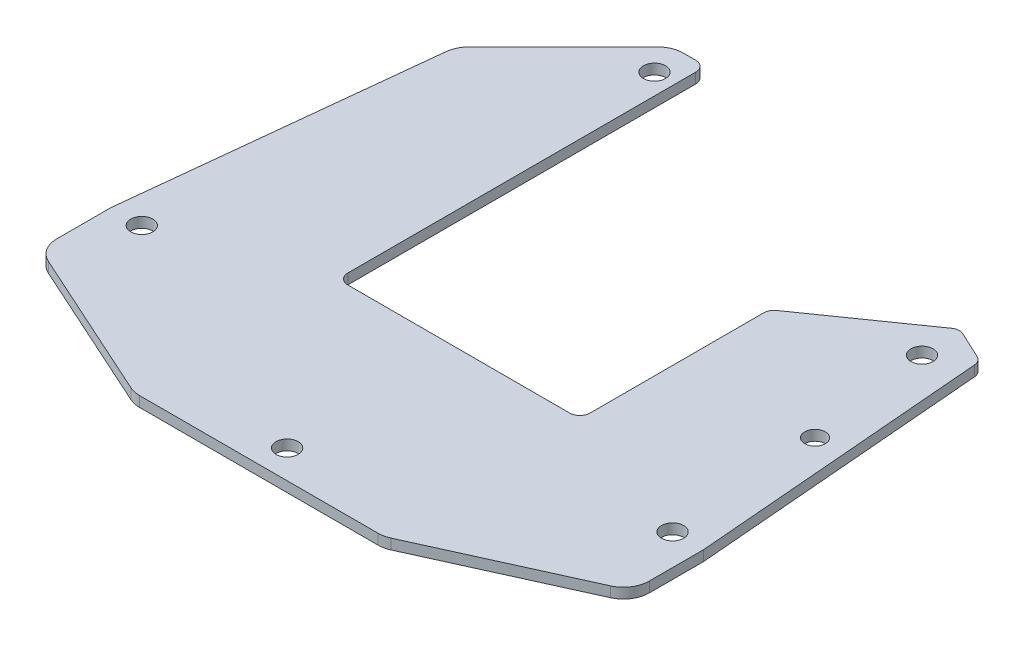
ISO-10303-21;
HEADER;
FILE_DESCRIPTION(('STEP AP214'),'2;1');
FILE_NAME('part.step','',(''),(''),'','','');
FILE_SCHEMA(('AUTOMOTIVE_DESIGN { 1 0 10303 214 1 1 1 1 }'));
ENDSEC;
DATA;
#1=APPLICATION_CONTEXT('core data for automotive mechanical design processes');
#2=APPLICATION_PROTOCOL_DEFINITION('international standard','automotive_design',2000,#1);
#3=PRODUCT_CONTEXT('',#1,'mechanical');
#4=PRODUCT('Part','Part','',(#3));
#5=PRODUCT_RELATED_PRODUCT_CATEGORY('part','',(#4));
#6=PRODUCT_DEFINITION_FORMATION('','',#4);
#7=PRODUCT_DEFINITION_CONTEXT('part definition',#1,'design');
#8=PRODUCT_DEFINITION('design','',#6,#7);
#9=PRODUCT_DEFINITION_SHAPE('','',#8);
#10=(LENGTH_UNIT() NAMED_UNIT(*) SI_UNIT(.MILLI.,.METRE.));
#11=(NAMED_UNIT(*) PLANE_ANGLE_UNIT() SI_UNIT($,.RADIAN.));
#12=(NAMED_UNIT(*) SI_UNIT($,.STERADIAN.) SOLID_ANGLE_UNIT());
#13=UNCERTAINTY_MEASURE_WITH_UNIT(LENGTH_MEASURE(1.E-05),#10,'distance_accuracy_value','');
#14=(GEOMETRIC_REPRESENTATION_CONTEXT(3) GLOBAL_UNCERTAINTY_ASSIGNED_CONTEXT((#13)) GLOBAL_UNIT_ASSIGNED_CONTEXT((#10,
#11,#12)) REPRESENTATION_CONTEXT('',''));
#15=CARTESIAN_POINT('',(0.,0.,0.));
#16=DIRECTION('',(0.,0.,1.));
#17=DIRECTION('',(1.,0.,0.));
#18=AXIS2_PLACEMENT_3D('',#15,#16,#17);
#19=CARTESIAN_POINT('',(-23.525,42.5,0.));
#20=DIRECTION('',(-1.,0.,0.));
#21=DIRECTION('',(0.,0.,1.));
#22=AXIS2_PLACEMENT_3D('',#19,#20,#21);
#23=PLANE('',#22);
#24=DIRECTION('',(0.,0.,-1.));
#25=VECTOR('',#24,1.);
#26=CARTESIAN_POINT('',(-23.525,40.5,0.));
#27=LINE('',#26,#25);
#28=CARTESIAN_POINT('',(-23.525,40.5,74.028736037846));
#29=VERTEX_POINT('',#28);
#30=CARTESIAN_POINT('',(-23.525,40.5,6.50000000000001));
#31=VERTEX_POINT('',#30);
#32=EDGE_CURVE('E265',#29,#31,#27,.T.);
#33=ORIENTED_EDGE('',*,*,#32,.T.);
#34=DIRECTION('',(0.,-1.,0.));
#35=VECTOR('',#34,1.);
#36=CARTESIAN_POINT('',(-23.525,42.5,6.50000000000001));
#37=LINE('',#36,#35);
#38=CARTESIAN_POINT('',(-23.525,42.5,6.50000000000001));
#39=VERTEX_POINT('',#38);
#40=EDGE_CURVE('E11',#39,#31,#37,.T.);
#41=ORIENTED_EDGE('',*,*,#40,.F.);
#42=DIRECTION('',(0.,0.,-1.));
#43=VECTOR('',#42,1.);
#44=CARTESIAN_POINT('',(-23.525,42.5,0.));
#45=LINE('',#44,#43);
#46=CARTESIAN_POINT('',(-23.525,42.5,74.028736037846));
#47=VERTEX_POINT('',#46);
#48=EDGE_CURVE('E855',#47,#39,#45,.T.);
#49=ORIENTED_EDGE('',*,*,#48,.F.);
#50=DIRECTION('',(0.,-1.,0.));
#51=VECTOR('',#50,1.);
#52=CARTESIAN_POINT('',(-23.525,42.5,74.028736037846));
#53=LINE('',#52,#51);
#54=EDGE_CURVE('E58',#47,#29,#53,.T.);
#55=ORIENTED_EDGE('',*,*,#54,.T.);
#56=EDGE_LOOP('',(#33,#41,#49,#55));
#57=FACE_BOUND('',#56,.T.);
#58=ADVANCED_FACE('F41',(#57),#23,.F.);
#59=CARTESIAN_POINT('',(-25.525,42.5,6.5));
#60=DIRECTION('',(0.,-1.,0.));
#61=DIRECTION('',(0.,0.,-1.));
#62=AXIS2_PLACEMENT_3D('',#59,#60,#61);
#63=CYLINDRICAL_SURFACE('',#62,2.);
#64=CARTESIAN_POINT('',(-25.525,40.5,6.5));
#65=DIRECTION('',(0.,1.,0.));
#66=DIRECTION('',(0.,0.,1.));
#67=AXIS2_PLACEMENT_3D('',#64,#65,#66);
#68=CIRCLE('',#67,2.);
#69=CARTESIAN_POINT('',(-25.525,40.5,4.5));
#70=VERTEX_POINT('',#69);
#71=EDGE_CURVE('E267',#31,#70,#68,.T.);
#72=ORIENTED_EDGE('',*,*,#71,.T.);
#73=DIRECTION('',(0.,-1.,0.));
#74=VECTOR('',#73,1.);
#75=CARTESIAN_POINT('',(-25.525,42.5,4.5));
#76=LINE('',#75,#74);
#77=CARTESIAN_POINT('',(-25.525,42.5,4.5));
#78=VERTEX_POINT('',#77);
#79=EDGE_CURVE('E50',#78,#70,#76,.T.);
#80=ORIENTED_EDGE('',*,*,#79,.F.);
#81=CARTESIAN_POINT('',(-25.525,42.5,6.5));
#82=DIRECTION('',(0.,1.,0.));
#83=DIRECTION('',(0.,0.,1.));
#84=AXIS2_PLACEMENT_3D('',#81,#82,#83);
#85=CIRCLE('',#84,2.);
#86=EDGE_CURVE('E150',#39,#78,#85,.T.);
#87=ORIENTED_EDGE('',*,*,#86,.F.);
#88=ORIENTED_EDGE('',*,*,#40,.T.);
#89=EDGE_LOOP('',(#72,#80,#87,#88));
#90=FACE_BOUND('',#89,.T.);
#91=ADVANCED_FACE('F468',(#90),#63,.T.);
#92=CARTESIAN_POINT('',(0.,42.5,4.5));
#93=DIRECTION('',(0.,0.,1.));
#94=DIRECTION('',(1.,0.,0.));
#95=AXIS2_PLACEMENT_3D('',#92,#93,#94);
#96=PLANE('',#95);
#97=DIRECTION('',(-1.,0.,0.));
#98=VECTOR('',#97,1.);
#99=CARTESIAN_POINT('',(0.,40.5,4.5));
#100=LINE('',#99,#98);
#101=CARTESIAN_POINT('',(-27.9392135623731,40.5,4.5));
#102=VERTEX_POINT('',#101);
#103=EDGE_CURVE('E269',#70,#102,#100,.T.);
#104=ORIENTED_EDGE('',*,*,#103,.T.);
#105=DIRECTION('',(0.,-1.,0.));
#106=VECTOR('',#105,1.);
#107=CARTESIAN_POINT('',(-27.9392135623731,42.5,4.5));
#108=LINE('',#107,#106);
#109=CARTESIAN_POINT('',(-27.9392135623731,42.5,4.5));
#110=VERTEX_POINT('',#109);
#111=EDGE_CURVE('E379',#110,#102,#108,.T.);
#112=ORIENTED_EDGE('',*,*,#111,.F.);
#113=DIRECTION('',(-1.,0.,0.));
#114=VECTOR('',#113,1.);
#115=CARTESIAN_POINT('',(0.,42.5,4.5));
#116=LINE('',#115,#114);
#117=EDGE_CURVE('E386',#78,#110,#116,.T.);
#118=ORIENTED_EDGE('',*,*,#117,.F.);
#119=ORIENTED_EDGE('',*,*,#79,.T.);
#120=EDGE_LOOP('',(#104,#112,#118,#119));
#121=FACE_BOUND('',#120,.T.);
#122=ADVANCED_FACE('F384',(#121),#96,.F.);
#123=CARTESIAN_POINT('',(-27.9392135623731,42.5,9.50000000000001));
#124=DIRECTION('',(0.,-1.,0.));
#125=DIRECTION('',(0.,0.,-1.));
#126=AXIS2_PLACEMENT_3D('',#123,#124,#125);
#127=CYLINDRICAL_SURFACE('',#126,5.);
#128=CARTESIAN_POINT('',(-27.9392135623731,40.5,9.50000000000001));
#129=DIRECTION('',(0.,1.,0.));
#130=DIRECTION('',(0.,0.,1.));
#131=AXIS2_PLACEMENT_3D('',#128,#129,#130);
#132=CIRCLE('',#131,5.);
#133=CARTESIAN_POINT('',(-31.4747474683059,40.5,5.96446609406728));
#134=VERTEX_POINT('',#133);
#135=EDGE_CURVE('E272',#134,#102,#132,.F.);
#136=ORIENTED_EDGE('',*,*,#135,.F.);
#137=DIRECTION('',(0.,-1.,0.));
#138=VECTOR('',#137,1.);
#139=CARTESIAN_POINT('',(-31.4747474683059,42.5,5.96446609406728));
#140=LINE('',#139,#138);
#141=CARTESIAN_POINT('',(-31.4747474683059,42.5,5.96446609406728));
#142=VERTEX_POINT('',#141);
#143=EDGE_CURVE('E377',#142,#134,#140,.T.);
#144=ORIENTED_EDGE('',*,*,#143,.F.);
#145=CARTESIAN_POINT('',(-27.9392135623731,42.5,9.50000000000001));
#146=DIRECTION('',(0.,1.,0.));
#147=DIRECTION('',(0.,0.,1.));
#148=AXIS2_PLACEMENT_3D('',#145,#146,#147);
#149=CIRCLE('',#148,5.);
#150=EDGE_CURVE('E397',#142,#110,#149,.F.);
#151=ORIENTED_EDGE('',*,*,#150,.T.);
#152=ORIENTED_EDGE('',*,*,#111,.T.);
#153=EDGE_LOOP('',(#136,#144,#151,#152));
#154=FACE_BOUND('',#153,.T.);
#155=ADVANCED_FACE('F393',(#154),#127,.T.);
#156=CARTESIAN_POINT('',(-12.7551406871194,42.5,-12.7551406871193));
#157=DIRECTION('',(0.707106781186549,0.,0.707106781186546));
#158=DIRECTION('',(0.707106781186546,0.,-0.707106781186549));
#159=AXIS2_PLACEMENT_3D('',#156,#157,#158);
#160=PLANE('',#159);
#161=DIRECTION('',(-0.707106781186546,0.,0.707106781186549));
#162=VECTOR('',#161,1.);
#163=CARTESIAN_POINT('',(-12.7551406871194,40.5,-12.7551406871193));
#164=LINE('',#163,#162);
#165=CARTESIAN_POINT('',(-49.7524872461859,40.5,24.2422058719474));
#166=VERTEX_POINT('',#165);
#167=EDGE_CURVE('E275',#134,#166,#164,.T.);
#168=ORIENTED_EDGE('',*,*,#167,.T.);
#169=DIRECTION('',(0.,-1.,0.));
#170=VECTOR('',#169,1.);
#171=CARTESIAN_POINT('',(-49.7524872461859,42.5,24.2422058719474));
#172=LINE('',#171,#170);
#173=CARTESIAN_POINT('',(-49.7524872461859,42.5,24.2422058719474));
#174=VERTEX_POINT('',#173);
#175=EDGE_CURVE('E374',#174,#166,#172,.T.);
#176=ORIENTED_EDGE('',*,*,#175,.F.);
#177=DIRECTION('',(-0.707106781186546,0.,0.707106781186549));
#178=VECTOR('',#177,1.);
#179=CARTESIAN_POINT('',(-12.7551406871194,42.5,-12.7551406871193));
#180=LINE('',#179,#178);
#181=EDGE_CURVE('E398',#142,#174,#180,.T.);
#182=ORIENTED_EDGE('',*,*,#181,.F.);
#183=ORIENTED_EDGE('',*,*,#143,.T.);
#184=EDGE_LOOP('',(#168,#176,#182,#183));
#185=FACE_BOUND('',#184,.T.);
#186=ADVANCED_FACE('F730',(#185),#160,.F.);
#187=CARTESIAN_POINT('',(-46.2169533402531,42.5,27.7777397778801));
#188=DIRECTION('',(0.,-1.,0.));
#189=DIRECTION('',(0.,0.,-1.));
#190=AXIS2_PLACEMENT_3D('',#187,#188,#189);
#191=CYLINDRICAL_SURFACE('',#190,4.99999999999999);
#192=CARTESIAN_POINT('',(-46.2169533402531,40.5,27.7777397778801));
#193=DIRECTION('',(0.,1.,0.));
#194=DIRECTION('',(0.,0.,1.));
#195=AXIS2_PLACEMENT_3D('',#192,#193,#194);
#196=CIRCLE('',#195,4.99999999999999);
#197=CARTESIAN_POINT('',(-51.188371333021,40.5,27.2438829232986));
#198=VERTEX_POINT('',#197);
#199=EDGE_CURVE('E277',#166,#198,#196,.T.);
#200=ORIENTED_EDGE('',*,*,#199,.T.);
#201=DIRECTION('',(0.,-1.,0.));
#202=VECTOR('',#201,1.);
#203=CARTESIAN_POINT('',(-51.188371333021,42.5,27.2438829232986));
#204=LINE('',#203,#202);
#205=CARTESIAN_POINT('',(-51.188371333021,42.5,27.2438829232986));
#206=VERTEX_POINT('',#205);
#207=EDGE_CURVE('E371',#206,#198,#204,.T.);
#208=ORIENTED_EDGE('',*,*,#207,.F.);
#209=CARTESIAN_POINT('',(-46.2169533402531,42.5,27.7777397778801));
#210=DIRECTION('',(0.,1.,0.));
#211=DIRECTION('',(0.,0.,1.));
#212=AXIS2_PLACEMENT_3D('',#209,#210,#211);
#213=CIRCLE('',#212,4.99999999999999);
#214=EDGE_CURVE('E400',#174,#206,#213,.T.);
#215=ORIENTED_EDGE('',*,*,#214,.F.);
#216=ORIENTED_EDGE('',*,*,#175,.T.);
#217=EDGE_LOOP('',(#200,#208,#215,#216));
#218=FACE_BOUND('',#217,.T.);
#219=ADVANCED_FACE('F722',(#218),#191,.T.);
#220=CARTESIAN_POINT('',(-47.7125789893137,42.5,-5.12362617270594));
#221=DIRECTION('',(0.994283598553578,0.,0.106771370916302));
#222=DIRECTION('',(0.106771370916302,0.,-0.994283598553579));
#223=AXIS2_PLACEMENT_3D('',#220,#221,#222);
#224=PLANE('',#223);
#225=DIRECTION('',(-0.106771370916302,0.,0.994283598553579));
#226=VECTOR('',#225,1.);
#227=CARTESIAN_POINT('',(-47.7125789893137,40.5,-5.12362617270594));
#228=LINE('',#227,#226);
#229=CARTESIAN_POINT('',(-57.5,40.5,86.0194592775373));
#230=VERTEX_POINT('',#229);
#231=EDGE_CURVE('E279',#198,#230,#228,.T.);
#232=ORIENTED_EDGE('',*,*,#231,.T.);
#233=DIRECTION('',(0.,-1.,0.));
#234=VECTOR('',#233,1.);
#235=CARTESIAN_POINT('',(-57.5,42.5,86.0194592775373));
#236=LINE('',#235,#234);
#237=CARTESIAN_POINT('',(-57.5,42.5,86.0194592775373));
#238=VERTEX_POINT('',#237);
#239=EDGE_CURVE('E368',#238,#230,#236,.T.);
#240=ORIENTED_EDGE('',*,*,#239,.F.);
#241=DIRECTION('',(-0.106771370916302,0.,0.994283598553579));
#242=VECTOR('',#241,1.);
#243=CARTESIAN_POINT('',(-47.7125789893137,42.5,-5.12362617270594));
#244=LINE('',#243,#242);
#245=EDGE_CURVE('E406',#206,#238,#244,.T.);
#246=ORIENTED_EDGE('',*,*,#245,.F.);
#247=ORIENTED_EDGE('',*,*,#207,.T.);
#248=EDGE_LOOP('',(#232,#240,#246,#247));
#249=FACE_BOUND('',#248,.T.);
#250=ADVANCED_FACE('F714',(#249),#224,.F.);
#251=CARTESIAN_POINT('',(-57.4999999999999,42.5,0.));
#252=DIRECTION('',(1.,0.,0.));
#253=DIRECTION('',(0.,0.,-1.));
#254=AXIS2_PLACEMENT_3D('',#251,#252,#253);
#255=PLANE('',#254);
#256=DIRECTION('',(0.,0.,1.));
#257=VECTOR('',#256,1.);
#258=CARTESIAN_POINT('',(-57.4999999999999,40.5,0.));
#259=LINE('',#258,#257);
#260=CARTESIAN_POINT('',(-57.5,40.5,96.5429778393859));
#261=VERTEX_POINT('',#260);
#262=EDGE_CURVE('E281',#230,#261,#259,.T.);
#263=ORIENTED_EDGE('',*,*,#262,.T.);
#264=DIRECTION('',(0.,-1.,0.));
#265=VECTOR('',#264,1.);
#266=CARTESIAN_POINT('',(-57.5,42.5,96.5429778393859));
#267=LINE('',#266,#265);
#268=CARTESIAN_POINT('',(-57.5,42.5,96.5429778393859));
#269=VERTEX_POINT('',#268);
#270=EDGE_CURVE('E366',#269,#261,#267,.T.);
#271=ORIENTED_EDGE('',*,*,#270,.F.);
#272=DIRECTION('',(0.,0.,1.));
#273=VECTOR('',#272,1.);
#274=CARTESIAN_POINT('',(-57.4999999999999,42.5,0.));
#275=LINE('',#274,#273);
#276=EDGE_CURVE('E408',#238,#269,#275,.T.);
#277=ORIENTED_EDGE('',*,*,#276,.F.);
#278=ORIENTED_EDGE('',*,*,#239,.T.);
#279=EDGE_LOOP('',(#263,#271,#277,#278));
#280=FACE_BOUND('',#279,.T.);
#281=ADVANCED_FACE('F706',(#280),#255,.F.);
#282=CARTESIAN_POINT('',(-52.5,42.5,96.5429778393859));
#283=DIRECTION('',(0.,-1.,0.));
#284=DIRECTION('',(0.,0.,-1.));
#285=AXIS2_PLACEMENT_3D('',#282,#283,#284);
#286=CYLINDRICAL_SURFACE('',#285,5.);
#287=CARTESIAN_POINT('',(-52.5,40.5,96.5429778393859));
#288=DIRECTION('',(0.,1.,0.));
#289=DIRECTION('',(0.,0.,1.));
#290=AXIS2_PLACEMENT_3D('',#287,#288,#289);
#291=CIRCLE('',#290,5.);
#292=CARTESIAN_POINT('',(-54.561143794715,40.5,101.098379716005));
#293=VERTEX_POINT('',#292);
#294=EDGE_CURVE('E284',#293,#261,#291,.F.);
#295=ORIENTED_EDGE('',*,*,#294,.F.);
#296=DIRECTION('',(0.,-1.,0.));
#297=VECTOR('',#296,1.);
#298=CARTESIAN_POINT('',(-54.561143794715,42.5,101.098379716005));
#299=LINE('',#298,#297);
#300=CARTESIAN_POINT('',(-54.561143794715,42.5,101.098379716005));
#301=VERTEX_POINT('',#300);
#302=EDGE_CURVE('E364',#301,#293,#299,.T.);
#303=ORIENTED_EDGE('',*,*,#302,.F.);
#304=CARTESIAN_POINT('',(-52.5,42.5,96.5429778393859));
#305=DIRECTION('',(0.,1.,0.));
#306=DIRECTION('',(0.,0.,1.));
#307=AXIS2_PLACEMENT_3D('',#304,#305,#306);
#308=CIRCLE('',#307,5.);
#309=EDGE_CURVE('E410',#301,#269,#308,.F.);
#310=ORIENTED_EDGE('',*,*,#309,.T.);
#311=ORIENTED_EDGE('',*,*,#270,.T.);
#312=EDGE_LOOP('',(#295,#303,#310,#311));
#313=FACE_BOUND('',#312,.T.);
#314=ADVANCED_FACE('F698',(#313),#286,.T.);
#315=CARTESIAN_POINT('',(-47.2415898711497,42.5,104.410195788056));
#316=DIRECTION('',(-0.412228758942985,0.,0.911080375323893));
#317=DIRECTION('',(0.911080375323893,0.,0.412228758942985));
#318=AXIS2_PLACEMENT_3D('',#315,#316,#317);
#319=PLANE('',#318);
#320=DIRECTION('',(-0.911080375323893,0.,-0.412228758942985));
#321=VECTOR('',#320,1.);
#322=CARTESIAN_POINT('',(-47.2415898711497,40.5,104.410195788056));
#323=LINE('',#322,#321);
#324=CARTESIAN_POINT('',(-25.2144527409695,40.5,114.376626465496));
#325=VERTEX_POINT('',#324);
#326=EDGE_CURVE('E287',#325,#293,#323,.T.);
#327=ORIENTED_EDGE('',*,*,#326,.F.);
#328=DIRECTION('',(0.,-1.,0.));
#329=VECTOR('',#328,1.);
#330=CARTESIAN_POINT('',(-25.2144527409695,42.5,114.376626465496));
#331=LINE('',#330,#329);
#332=CARTESIAN_POINT('',(-25.2144527409695,42.5,114.376626465496));
#333=VERTEX_POINT('',#332);
#334=EDGE_CURVE('E362',#333,#325,#331,.T.);
#335=ORIENTED_EDGE('',*,*,#334,.F.);
#336=DIRECTION('',(-0.911080375323893,0.,-0.412228758942985));
#337=VECTOR('',#336,1.);
#338=CARTESIAN_POINT('',(-47.2415898711497,42.5,104.410195788056));
#339=LINE('',#338,#337);
#340=EDGE_CURVE('E413',#333,#301,#339,.T.);
#341=ORIENTED_EDGE('',*,*,#340,.T.);
#342=ORIENTED_EDGE('',*,*,#302,.T.);
#343=EDGE_LOOP('',(#327,#335,#341,#342));
#344=FACE_BOUND('',#343,.T.);
#345=ADVANCED_FACE('F690',(#344),#319,.T.);
#346=CARTESIAN_POINT('',(-23.1533089462546,42.5,109.821224588876));
#347=DIRECTION('',(0.,-1.,0.));
#348=DIRECTION('',(0.,0.,-1.));
#349=AXIS2_PLACEMENT_3D('',#346,#347,#348);
#350=CYLINDRICAL_SURFACE('',#349,5.00000000000001);
#351=CARTESIAN_POINT('',(-23.1533089462546,40.5,109.821224588876));
#352=DIRECTION('',(0.,1.,0.));
#353=DIRECTION('',(0.,0.,1.));
#354=AXIS2_PLACEMENT_3D('',#351,#352,#353);
#355=CIRCLE('',#354,5.00000000000001);
#356=CARTESIAN_POINT('',(-23.1533089462546,40.5,114.821224588876));
#357=VERTEX_POINT('',#356);
#358=EDGE_CURVE('E290',#325,#357,#355,.T.);
#359=ORIENTED_EDGE('',*,*,#358,.T.);
#360=DIRECTION('',(0.,-1.,0.));
#361=VECTOR('',#360,1.);
#362=CARTESIAN_POINT('',(-23.1533089462546,42.5,114.821224588876));
#363=LINE('',#362,#361);
#364=CARTESIAN_POINT('',(-23.1533089462546,42.5,114.821224588876));
#365=VERTEX_POINT('',#364);
#366=EDGE_CURVE('E359',#365,#357,#363,.T.);
#367=ORIENTED_EDGE('',*,*,#366,.F.);
#368=CARTESIAN_POINT('',(-23.1533089462546,42.5,109.821224588876));
#369=DIRECTION('',(0.,1.,0.));
#370=DIRECTION('',(0.,0.,1.));
#371=AXIS2_PLACEMENT_3D('',#368,#369,#370);
#372=CIRCLE('',#371,5.00000000000001);
#373=EDGE_CURVE('E416',#333,#365,#372,.T.);
#374=ORIENTED_EDGE('',*,*,#373,.F.);
#375=ORIENTED_EDGE('',*,*,#334,.T.);
#376=EDGE_LOOP('',(#359,#367,#374,#375));
#377=FACE_BOUND('',#376,.T.);
#378=ADVANCED_FACE('F682',(#377),#350,.T.);
#379=CARTESIAN_POINT('',(0.,42.5,114.821224588876));
#380=DIRECTION('',(0.,0.,-1.));
#381=DIRECTION('',(-1.,0.,0.));
#382=AXIS2_PLACEMENT_3D('',#379,#380,#381);
#383=PLANE('',#382);
#384=DIRECTION('',(1.,0.,0.));
#385=VECTOR('',#384,1.);
#386=CARTESIAN_POINT('',(0.,40.5,114.821224588876));
#387=LINE('',#386,#385);
#388=CARTESIAN_POINT('',(23.1533089462546,40.5,114.821224588876));
#389=VERTEX_POINT('',#388);
#390=EDGE_CURVE('E292',#357,#389,#387,.T.);
#391=ORIENTED_EDGE('',*,*,#390,.T.);
#392=DIRECTION('',(0.,-1.,0.));
#393=VECTOR('',#392,1.);
#394=CARTESIAN_POINT('',(23.1533089462546,42.5,114.821224588876));
#395=LINE('',#394,#393);
#396=CARTESIAN_POINT('',(23.1533089462546,42.5,114.821224588876));
#397=VERTEX_POINT('',#396);
#398=EDGE_CURVE('E357',#397,#389,#395,.T.);
#399=ORIENTED_EDGE('',*,*,#398,.F.);
#400=DIRECTION('',(1.,0.,0.));
#401=VECTOR('',#400,1.);
#402=CARTESIAN_POINT('',(0.,42.5,114.821224588876));
#403=LINE('',#402,#401);
#404=EDGE_CURVE('E418',#365,#397,#403,.T.);
#405=ORIENTED_EDGE('',*,*,#404,.F.);
#406=ORIENTED_EDGE('',*,*,#366,.T.);
#407=EDGE_LOOP('',(#391,#399,#405,#406));
#408=FACE_BOUND('',#407,.T.);
#409=ADVANCED_FACE('F674',(#408),#383,.F.);
#410=CARTESIAN_POINT('',(23.1533089462546,42.5,109.821224588876));
#411=DIRECTION('',(0.,-1.,0.));
#412=DIRECTION('',(0.,0.,-1.));
#413=AXIS2_PLACEMENT_3D('',#410,#411,#412);
#414=CYLINDRICAL_SURFACE('',#413,5.00000000000001);
#415=CARTESIAN_POINT('',(23.1533089462546,40.5,109.821224588876));
#416=DIRECTION('',(0.,1.,0.));
#417=DIRECTION('',(0.,0.,1.));
#418=AXIS2_PLACEMENT_3D('',#415,#416,#417);
#419=CIRCLE('',#418,5.00000000000001);
#420=CARTESIAN_POINT('',(25.2144527409695,40.5,114.376626465496));
#421=VERTEX_POINT('',#420);
#422=EDGE_CURVE('E295',#421,#389,#419,.F.);
#423=ORIENTED_EDGE('',*,*,#422,.F.);
#424=DIRECTION('',(0.,-1.,0.));
#425=VECTOR('',#424,1.);
#426=CARTESIAN_POINT('',(25.2144527409695,42.5,114.376626465496));
#427=LINE('',#426,#425);
#428=CARTESIAN_POINT('',(25.2144527409695,42.5,114.376626465496));
#429=VERTEX_POINT('',#428);
#430=EDGE_CURVE('E355',#429,#421,#427,.T.);
#431=ORIENTED_EDGE('',*,*,#430,.F.);
#432=CARTESIAN_POINT('',(23.1533089462546,42.5,109.821224588876));
#433=DIRECTION('',(0.,1.,0.));
#434=DIRECTION('',(0.,0.,1.));
#435=AXIS2_PLACEMENT_3D('',#432,#433,#434);
#436=CIRCLE('',#435,5.00000000000001);
#437=EDGE_CURVE('E420',#429,#397,#436,.F.);
#438=ORIENTED_EDGE('',*,*,#437,.T.);
#439=ORIENTED_EDGE('',*,*,#398,.T.);
#440=EDGE_LOOP('',(#423,#431,#438,#439));
#441=FACE_BOUND('',#440,.T.);
#442=ADVANCED_FACE('F666',(#441),#414,.T.);
#443=CARTESIAN_POINT('',(47.2415898711497,42.5,104.410195788056));
#444=DIRECTION('',(-0.412228758942985,0.,-0.911080375323893));
#445=DIRECTION('',(-0.911080375323893,0.,0.412228758942985));
#446=AXIS2_PLACEMENT_3D('',#443,#444,#445);
#447=PLANE('',#446);
#448=DIRECTION('',(0.911080375323893,0.,-0.412228758942985));
#449=VECTOR('',#448,1.);
#450=CARTESIAN_POINT('',(47.2415898711497,40.5,104.410195788056));
#451=LINE('',#450,#449);
#452=CARTESIAN_POINT('',(54.561143794715,40.5,101.098379716005));
#453=VERTEX_POINT('',#452);
#454=EDGE_CURVE('E298',#421,#453,#451,.T.);
#455=ORIENTED_EDGE('',*,*,#454,.T.);
#456=DIRECTION('',(0.,-1.,0.));
#457=VECTOR('',#456,1.);
#458=CARTESIAN_POINT('',(54.561143794715,42.5,101.098379716005));
#459=LINE('',#458,#457);
#460=CARTESIAN_POINT('',(54.561143794715,42.5,101.098379716005));
#461=VERTEX_POINT('',#460);
#462=EDGE_CURVE('E352',#461,#453,#459,.T.);
#463=ORIENTED_EDGE('',*,*,#462,.F.);
#464=DIRECTION('',(0.911080375323893,0.,-0.412228758942985));
#465=VECTOR('',#464,1.);
#466=CARTESIAN_POINT('',(47.2415898711497,42.5,104.410195788056));
#467=LINE('',#466,#465);
#468=EDGE_CURVE('E423',#429,#461,#467,.T.);
#469=ORIENTED_EDGE('',*,*,#468,.F.);
#470=ORIENTED_EDGE('',*,*,#430,.T.);
#471=EDGE_LOOP('',(#455,#463,#469,#470));
#472=FACE_BOUND('',#471,.T.);
#473=ADVANCED_FACE('F658',(#472),#447,.F.);
#474=CARTESIAN_POINT('',(52.5,42.5,96.5429778393859));
#475=DIRECTION('',(0.,-1.,0.));
#476=DIRECTION('',(0.,0.,-1.));
#477=AXIS2_PLACEMENT_3D('',#474,#475,#476);
#478=CYLINDRICAL_SURFACE('',#477,5.);
#479=CARTESIAN_POINT('',(52.5,40.5,96.5429778393859));
#480=DIRECTION('',(0.,1.,0.));
#481=DIRECTION('',(0.,0.,1.));
#482=AXIS2_PLACEMENT_3D('',#479,#480,#481);
#483=CIRCLE('',#482,5.);
#484=CARTESIAN_POINT('',(57.5,40.5,96.5429778393859));
#485=VERTEX_POINT('',#484);
#486=EDGE_CURVE('E300',#453,#485,#483,.T.);
#487=ORIENTED_EDGE('',*,*,#486,.T.);
#488=DIRECTION('',(0.,-1.,0.));
#489=VECTOR('',#488,1.);
#490=CARTESIAN_POINT('',(57.5,42.5,96.5429778393859));
#491=LINE('',#490,#489);
#492=CARTESIAN_POINT('',(57.5,42.5,96.5429778393859));
#493=VERTEX_POINT('',#492);
#494=EDGE_CURVE('E349',#493,#485,#491,.T.);
#495=ORIENTED_EDGE('',*,*,#494,.F.);
#496=CARTESIAN_POINT('',(52.5,42.5,96.5429778393859));
#497=DIRECTION('',(0.,1.,0.));
#498=DIRECTION('',(0.,0.,1.));
#499=AXIS2_PLACEMENT_3D('',#496,#497,#498);
#500=CIRCLE('',#499,5.);
#501=EDGE_CURVE('E425',#461,#493,#500,.T.);
#502=ORIENTED_EDGE('',*,*,#501,.F.);
#503=ORIENTED_EDGE('',*,*,#462,.T.);
#504=EDGE_LOOP('',(#487,#495,#502,#503));
#505=FACE_BOUND('',#504,.T.);
#506=ADVANCED_FACE('F650',(#505),#478,.T.);
#507=CARTESIAN_POINT('',(57.4999999999999,42.5,0.));
#508=DIRECTION('',(-1.,0.,0.));
#509=DIRECTION('',(0.,0.,1.));
#510=AXIS2_PLACEMENT_3D('',#507,#508,#509);
#511=PLANE('',#510);
#512=DIRECTION('',(0.,0.,-1.));
#513=VECTOR('',#512,1.);
#514=CARTESIAN_POINT('',(57.4999999999999,40.5,0.));
#515=LINE('',#514,#513);
#516=CARTESIAN_POINT('',(57.5,40.5,86.0194592775373));
#517=VERTEX_POINT('',#516);
#518=EDGE_CURVE('E302',#485,#517,#515,.T.);
#519=ORIENTED_EDGE('',*,*,#518,.T.);
#520=DIRECTION('',(0.,-1.,0.));
#521=VECTOR('',#520,1.);
#522=CARTESIAN_POINT('',(57.5,42.5,86.0194592775373));
#523=LINE('',#522,#521);
#524=CARTESIAN_POINT('',(57.5,42.5,86.0194592775373));
#525=VERTEX_POINT('',#524);
#526=EDGE_CURVE('E347',#525,#517,#523,.T.);
#527=ORIENTED_EDGE('',*,*,#526,.F.);
#528=DIRECTION('',(0.,0.,-1.));
#529=VECTOR('',#528,1.);
#530=CARTESIAN_POINT('',(57.4999999999999,42.5,0.));
#531=LINE('',#530,#529);
#532=EDGE_CURVE('E427',#493,#525,#531,.T.);
#533=ORIENTED_EDGE('',*,*,#532,.F.);
#534=ORIENTED_EDGE('',*,*,#494,.T.);
#535=EDGE_LOOP('',(#519,#527,#533,#534));
#536=FACE_BOUND('',#535,.T.);
#537=ADVANCED_FACE('F642',(#536),#511,.F.);
#538=CARTESIAN_POINT('',(50.0128125991602,42.5,-4.15267216577232));
#539=DIRECTION('',(0.996570552373539,0.,-0.0827474116930475));
#540=DIRECTION('',(-0.0827474116930475,0.,-0.996570552373539));
#541=AXIS2_PLACEMENT_3D('',#538,#539,#540);
#542=PLANE('',#541);
#543=DIRECTION('',(0.0827474116930475,0.,0.996570552373539));
#544=VECTOR('',#543,1.);
#545=CARTESIAN_POINT('',(50.0128125991602,40.5,-4.15267216577232));
#546=LINE('',#545,#544);
#547=CARTESIAN_POINT('',(52.7365121048578,40.5,28.6502719427585));
#548=VERTEX_POINT('',#547);
#549=EDGE_CURVE('E305',#548,#517,#546,.T.);
#550=ORIENTED_EDGE('',*,*,#549,.F.);
#551=DIRECTION('',(0.,-1.,0.));
#552=VECTOR('',#551,1.);
#553=CARTESIAN_POINT('',(52.7365121048578,42.5,28.6502719427585));
#554=LINE('',#553,#552);
#555=CARTESIAN_POINT('',(52.7365121048578,42.5,28.6502719427585));
#556=VERTEX_POINT('',#555);
#557=EDGE_CURVE('E345',#556,#548,#554,.T.);
#558=ORIENTED_EDGE('',*,*,#557,.F.);
#559=DIRECTION('',(0.0827474116930475,0.,0.996570552373539));
#560=VECTOR('',#559,1.);
#561=CARTESIAN_POINT('',(50.0128125991602,42.5,-4.15267216577232));
#562=LINE('',#561,#560);
#563=EDGE_CURVE('E429',#556,#525,#562,.T.);
#564=ORIENTED_EDGE('',*,*,#563,.T.);
#565=ORIENTED_EDGE('',*,*,#526,.T.);
#566=EDGE_LOOP('',(#550,#558,#564,#565));
#567=FACE_BOUND('',#566,.T.);
#568=ADVANCED_FACE('F634',(#567),#542,.T.);
#569=CARTESIAN_POINT('',(50.7433710001108,42.5,28.8157667661446));
#570=DIRECTION('',(0.,-1.,0.));
#571=DIRECTION('',(0.,0.,-1.));
#572=AXIS2_PLACEMENT_3D('',#569,#570,#571);
#573=CYLINDRICAL_SURFACE('',#572,2.);
#574=CARTESIAN_POINT('',(50.7433710001108,40.5,28.8157667661446));
#575=DIRECTION('',(0.,1.,0.));
#576=DIRECTION('',(0.,0.,1.));
#577=AXIS2_PLACEMENT_3D('',#574,#575,#576);
#578=CIRCLE('',#577,2.);
#579=CARTESIAN_POINT('',(51.5926152553745,40.5,27.0050254276587));
#580=VERTEX_POINT('',#579);
#581=EDGE_CURVE('E308',#580,#548,#578,.F.);
#582=ORIENTED_EDGE('',*,*,#581,.F.);
#583=DIRECTION('',(0.,-1.,0.));
#584=VECTOR('',#583,1.);
#585=CARTESIAN_POINT('',(51.5926152553745,42.5,27.0050254276587));
#586=LINE('',#585,#584);
#587=CARTESIAN_POINT('',(51.5926152553745,42.5,27.0050254276587));
#588=VERTEX_POINT('',#587);
#589=EDGE_CURVE('E343',#588,#580,#586,.T.);
#590=ORIENTED_EDGE('',*,*,#589,.F.);
#591=CARTESIAN_POINT('',(50.7433710001108,42.5,28.8157667661446));
#592=DIRECTION('',(0.,1.,0.));
#593=DIRECTION('',(0.,0.,1.));
#594=AXIS2_PLACEMENT_3D('',#591,#592,#593);
#595=CIRCLE('',#594,2.);
#596=EDGE_CURVE('E432',#588,#556,#595,.F.);
#597=ORIENTED_EDGE('',*,*,#596,.T.);
#598=ORIENTED_EDGE('',*,*,#557,.T.);
#599=EDGE_LOOP('',(#582,#590,#597,#598));
#600=FACE_BOUND('',#599,.T.);
#601=ADVANCED_FACE('F626',(#600),#573,.T.);
#602=CARTESIAN_POINT('',(-1.07947092685869,42.5,2.30162596784324));
#603=DIRECTION('',(-0.424622127631861,0.,0.90537066924293));
#604=DIRECTION('',(0.905370669242931,0.,0.424622127631861));
#605=AXIS2_PLACEMENT_3D('',#602,#603,#604);
#606=PLANE('',#605);
#607=DIRECTION('',(-0.905370669242931,0.,-0.424622127631861));
#608=VECTOR('',#607,1.);
#609=CARTESIAN_POINT('',(-1.07947092685869,40.5,2.30162596784324));
#610=LINE('',#609,#608);
#611=CARTESIAN_POINT('',(46.3520945314715,40.5,24.5472022009097));
#612=VERTEX_POINT('',#611);
#613=EDGE_CURVE('E311',#580,#612,#610,.T.);
#614=ORIENTED_EDGE('',*,*,#613,.T.);
#615=DIRECTION('',(0.,-1.,0.));
#616=VECTOR('',#615,1.);
#617=CARTESIAN_POINT('',(46.3520945314715,42.5,24.5472022009097));
#618=LINE('',#617,#616);
#619=CARTESIAN_POINT('',(46.3520945314715,42.5,24.5472022009097));
#620=VERTEX_POINT('',#619);
#621=EDGE_CURVE('E340',#620,#612,#618,.T.);
#622=ORIENTED_EDGE('',*,*,#621,.F.);
#623=DIRECTION('',(-0.905370669242931,0.,-0.424622127631861));
#624=VECTOR('',#623,1.);
#625=CARTESIAN_POINT('',(-1.07947092685869,42.5,2.30162596784324));
#626=LINE('',#625,#624);
#627=EDGE_CURVE('E435',#588,#620,#626,.T.);
#628=ORIENTED_EDGE('',*,*,#627,.F.);
#629=ORIENTED_EDGE('',*,*,#589,.T.);
#630=EDGE_LOOP('',(#614,#622,#628,#629));
#631=FACE_BOUND('',#630,.T.);
#632=ADVANCED_FACE('F618',(#631),#606,.F.);
#633=CARTESIAN_POINT('',(45.5028502762078,42.5,26.3579435393956));
#634=DIRECTION('',(0.,-1.,0.));
#635=DIRECTION('',(0.,0.,-1.));
#636=AXIS2_PLACEMENT_3D('',#633,#634,#635);
#637=CYLINDRICAL_SURFACE('',#636,2.);
#638=CARTESIAN_POINT('',(45.5028502762078,40.5,26.3579435393956));
#639=DIRECTION('',(0.,1.,0.));
#640=DIRECTION('',(0.,0.,1.));
#641=AXIS2_PLACEMENT_3D('',#638,#639,#640);
#642=CIRCLE('',#641,2.);
#643=CARTESIAN_POINT('',(44.3556974035057,40.5,24.7196394508176));
#644=VERTEX_POINT('',#643);
#645=EDGE_CURVE('E313',#612,#644,#642,.T.);
#646=ORIENTED_EDGE('',*,*,#645,.T.);
#647=DIRECTION('',(0.,-1.,0.));
#648=VECTOR('',#647,1.);
#649=CARTESIAN_POINT('',(44.3556974035057,42.5,24.7196394508176));
#650=LINE('',#649,#648);
#651=CARTESIAN_POINT('',(44.3556974035057,42.5,24.7196394508176));
#652=VERTEX_POINT('',#651);
#653=EDGE_CURVE('E337',#652,#644,#650,.T.);
#654=ORIENTED_EDGE('',*,*,#653,.F.);
#655=CARTESIAN_POINT('',(45.5028502762078,42.5,26.3579435393956));
#656=DIRECTION('',(0.,1.,0.));
#657=DIRECTION('',(0.,0.,1.));
#658=AXIS2_PLACEMENT_3D('',#655,#656,#657);
#659=CIRCLE('',#658,2.);
#660=EDGE_CURVE('E437',#620,#652,#659,.T.);
#661=ORIENTED_EDGE('',*,*,#660,.F.);
#662=ORIENTED_EDGE('',*,*,#621,.T.);
#663=EDGE_LOOP('',(#646,#654,#661,#662));
#664=FACE_BOUND('',#663,.T.);
#665=ADVANCED_FACE('F610',(#664),#637,.T.);
#666=CARTESIAN_POINT('',(26.207009100335,42.5,37.4274878093161));
#667=DIRECTION('',(0.573576436351045,0.,0.819152044288993));
#668=DIRECTION('',(0.819152044288993,0.,-0.573576436351045));
#669=AXIS2_PLACEMENT_3D('',#666,#667,#668);
#670=PLANE('',#669);
#671=DIRECTION('',(-0.819152044288993,0.,0.573576436351045));
#672=VECTOR('',#671,1.);
#673=CARTESIAN_POINT('',(26.207009100335,40.5,37.4274878093161));
#674=LINE('',#673,#672);
#675=CARTESIAN_POINT('',(24.3778471272979,40.5,38.7082808114432));
#676=VERTEX_POINT('',#675);
#677=EDGE_CURVE('E315',#644,#676,#674,.T.);
#678=ORIENTED_EDGE('',*,*,#677,.T.);
#679=DIRECTION('',(0.,-1.,0.));
#680=VECTOR('',#679,1.);
#681=CARTESIAN_POINT('',(24.3778471272979,42.5,38.7082808114432));
#682=LINE('',#681,#680);
#683=CARTESIAN_POINT('',(24.3778471272979,42.5,38.7082808114432));
#684=VERTEX_POINT('',#683);
#685=EDGE_CURVE('E334',#684,#676,#682,.T.);
#686=ORIENTED_EDGE('',*,*,#685,.F.);
#687=DIRECTION('',(-0.819152044288993,0.,0.573576436351045));
#688=VECTOR('',#687,1.);
#689=CARTESIAN_POINT('',(26.207009100335,42.5,37.4274878093161));
#690=LINE('',#689,#688);
#691=EDGE_CURVE('E439',#652,#684,#690,.T.);
#692=ORIENTED_EDGE('',*,*,#691,.F.);
#693=ORIENTED_EDGE('',*,*,#653,.T.);
#694=EDGE_LOOP('',(#678,#686,#692,#693));
#695=FACE_BOUND('',#694,.T.);
#696=ADVANCED_FACE('F603',(#695),#670,.F.);
#697=CARTESIAN_POINT('',(25.525,42.5,40.3465849000212));
#698=DIRECTION('',(0.,-1.,0.));
#699=DIRECTION('',(0.,0.,-1.));
#700=AXIS2_PLACEMENT_3D('',#697,#698,#699);
#701=CYLINDRICAL_SURFACE('',#700,2.);
#702=CARTESIAN_POINT('',(25.525,40.5,40.3465849000212));
#703=DIRECTION('',(0.,1.,0.));
#704=DIRECTION('',(0.,0.,1.));
#705=AXIS2_PLACEMENT_3D('',#702,#703,#704);
#706=CIRCLE('',#705,2.);
#707=CARTESIAN_POINT('',(23.525,40.5,40.3465849000212));
#708=VERTEX_POINT('',#707);
#709=EDGE_CURVE('E317',#676,#708,#706,.T.);
#710=ORIENTED_EDGE('',*,*,#709,.T.);
#711=DIRECTION('',(0.,-1.,0.));
#712=VECTOR('',#711,1.);
#713=CARTESIAN_POINT('',(23.525,42.5,40.3465849000212));
#714=LINE('',#713,#712);
#715=CARTESIAN_POINT('',(23.525,42.5,40.3465849000212));
#716=VERTEX_POINT('',#715);
#717=EDGE_CURVE('E331',#716,#708,#714,.T.);
#718=ORIENTED_EDGE('',*,*,#717,.F.);
#719=CARTESIAN_POINT('',(25.525,42.5,40.3465849000212));
#720=DIRECTION('',(0.,1.,0.));
#721=DIRECTION('',(0.,0.,1.));
#722=AXIS2_PLACEMENT_3D('',#719,#720,#721);
#723=CIRCLE('',#722,2.);
#724=EDGE_CURVE('E441',#684,#716,#723,.T.);
#725=ORIENTED_EDGE('',*,*,#724,.F.);
#726=ORIENTED_EDGE('',*,*,#685,.T.);
#727=EDGE_LOOP('',(#710,#718,#725,#726));
#728=FACE_BOUND('',#727,.T.);
#729=ADVANCED_FACE('F447',(#728),#701,.T.);
#730=CARTESIAN_POINT('',(23.525,42.5,0.));
#731=DIRECTION('',(1.,0.,0.));
#732=DIRECTION('',(0.,0.,-1.));
#733=AXIS2_PLACEMENT_3D('',#730,#731,#732);
#734=PLANE('',#733);
#735=DIRECTION('',(0.,0.,1.));
#736=VECTOR('',#735,1.);
#737=CARTESIAN_POINT('',(23.525,40.5,0.));
#738=LINE('',#737,#736);
#739=CARTESIAN_POINT('',(23.525,40.5,74.028736037846));
#740=VERTEX_POINT('',#739);
#741=EDGE_CURVE('E319',#708,#740,#738,.T.);
#742=ORIENTED_EDGE('',*,*,#741,.T.);
#743=DIRECTION('',(0.,-1.,0.));
#744=VECTOR('',#743,1.);
#745=CARTESIAN_POINT('',(23.525,42.5,74.028736037846));
#746=LINE('',#745,#744);
#747=CARTESIAN_POINT('',(23.525,42.5,74.028736037846));
#748=VERTEX_POINT('',#747);
#749=EDGE_CURVE('E239',#748,#740,#746,.T.);
#750=ORIENTED_EDGE('',*,*,#749,.F.);
#751=DIRECTION('',(0.,0.,1.));
#752=VECTOR('',#751,1.);
#753=CARTESIAN_POINT('',(23.525,42.5,0.));
#754=LINE('',#753,#752);
#755=EDGE_CURVE('E227',#716,#748,#754,.T.);
#756=ORIENTED_EDGE('',*,*,#755,.F.);
#757=ORIENTED_EDGE('',*,*,#717,.T.);
#758=EDGE_LOOP('',(#742,#750,#756,#757));
#759=FACE_BOUND('',#758,.T.);
#760=ADVANCED_FACE('F451',(#759),#734,.F.);
#761=CARTESIAN_POINT('',(21.525,42.5,74.028736037846));
#762=DIRECTION('',(0.,-1.,0.));
#763=DIRECTION('',(0.,0.,-1.));
#764=AXIS2_PLACEMENT_3D('',#761,#762,#763);
#765=CYLINDRICAL_SURFACE('',#764,2.);
#766=CARTESIAN_POINT('',(21.525,40.5,74.028736037846));
#767=DIRECTION('',(0.,1.,0.));
#768=DIRECTION('',(0.,0.,1.));
#769=AXIS2_PLACEMENT_3D('',#766,#767,#768);
#770=CIRCLE('',#769,2.);
#771=CARTESIAN_POINT('',(21.525,40.5,76.028736037846));
#772=VERTEX_POINT('',#771);
#773=EDGE_CURVE('E236',#740,#772,#770,.F.);
#774=ORIENTED_EDGE('',*,*,#773,.T.);
#775=DIRECTION('',(0.,-1.,0.));
#776=VECTOR('',#775,1.);
#777=CARTESIAN_POINT('',(21.525,42.5,76.028736037846));
#778=LINE('',#777,#776);
#779=CARTESIAN_POINT('',(21.525,42.5,76.028736037846));
#780=VERTEX_POINT('',#779);
#781=EDGE_CURVE('E233',#780,#772,#778,.T.);
#782=ORIENTED_EDGE('',*,*,#781,.F.);
#783=CARTESIAN_POINT('',(21.525,42.5,74.028736037846));
#784=DIRECTION('',(0.,1.,0.));
#785=DIRECTION('',(0.,0.,1.));
#786=AXIS2_PLACEMENT_3D('',#783,#784,#785);
#787=CIRCLE('',#786,2.);
#788=EDGE_CURVE('E220',#748,#780,#787,.F.);
#789=ORIENTED_EDGE('',*,*,#788,.F.);
#790=ORIENTED_EDGE('',*,*,#749,.T.);
#791=EDGE_LOOP('',(#774,#782,#789,#790));
#792=FACE_BOUND('',#791,.T.);
#793=ADVANCED_FACE('F234',(#792),#765,.F.);
#794=CARTESIAN_POINT('',(0.,42.5,76.028736037846));
#795=DIRECTION('',(0.,0.,-1.));
#796=DIRECTION('',(-1.,0.,0.));
#797=AXIS2_PLACEMENT_3D('',#794,#795,#796);
#798=PLANE('',#797);
#799=DIRECTION('',(1.,0.,0.));
#800=VECTOR('',#799,1.);
#801=CARTESIAN_POINT('',(0.,40.5,76.028736037846));
#802=LINE('',#801,#800);
#803=CARTESIAN_POINT('',(-21.525,40.5,76.028736037846));
#804=VERTEX_POINT('',#803);
#805=EDGE_CURVE('E322',#804,#772,#802,.T.);
#806=ORIENTED_EDGE('',*,*,#805,.F.);
#807=DIRECTION('',(0.,-1.,0.));
#808=VECTOR('',#807,1.);
#809=CARTESIAN_POINT('',(-21.525,42.5,76.028736037846));
#810=LINE('',#809,#808);
#811=CARTESIAN_POINT('',(-21.525,42.5,76.028736037846));
#812=VERTEX_POINT('',#811);
#813=EDGE_CURVE('E138',#812,#804,#810,.T.);
#814=ORIENTED_EDGE('',*,*,#813,.F.);
#815=DIRECTION('',(1.,0.,0.));
#816=VECTOR('',#815,1.);
#817=CARTESIAN_POINT('',(0.,42.5,76.028736037846));
#818=LINE('',#817,#816);
#819=EDGE_CURVE('E225',#812,#780,#818,.T.);
#820=ORIENTED_EDGE('',*,*,#819,.T.);
#821=ORIENTED_EDGE('',*,*,#781,.T.);
#822=EDGE_LOOP('',(#806,#814,#820,#821));
#823=FACE_BOUND('',#822,.T.);
#824=ADVANCED_FACE('F241',(#823),#798,.T.);
#825=CARTESIAN_POINT('',(0.,42.5,109.321224588876));
#826=DIRECTION('',(0.,-1.,0.));
#827=DIRECTION('',(0.,0.,-1.));
#828=AXIS2_PLACEMENT_3D('',#825,#826,#827);
#829=CYLINDRICAL_SURFACE('',#828,2.15);
#830=CARTESIAN_POINT('',(0.,42.5,109.321224588876));
#831=DIRECTION('',(0.,1.,0.));
#832=DIRECTION('',(0.,0.,1.));
#833=AXIS2_PLACEMENT_3D('',#830,#831,#832);
#834=CIRCLE('',#833,2.15);
#835=CARTESIAN_POINT('',(0.,42.5,111.471224588876));
#836=VERTEX_POINT('',#835);
#837=EDGE_CURVE('E852',#836,#836,#834,.T.);
#838=ORIENTED_EDGE('',*,*,#837,.T.);
#839=EDGE_LOOP('',(#838));
#840=FACE_BOUND('',#839,.T.);
#841=CARTESIAN_POINT('',(0.,40.5,109.321224588876));
#842=DIRECTION('',(0.,1.,0.));
#843=DIRECTION('',(0.,0.,1.));
#844=AXIS2_PLACEMENT_3D('',#841,#842,#843);
#845=CIRCLE('',#844,2.15);
#846=CARTESIAN_POINT('',(0.,40.5,111.471224588876));
#847=VERTEX_POINT('',#846);
#848=EDGE_CURVE('E262',#847,#847,#845,.T.);
#849=ORIENTED_EDGE('',*,*,#848,.F.);
#850=EDGE_LOOP('',(#849));
#851=FACE_BOUND('',#850,.T.);
#852=ADVANCED_FACE('F477',(#840,#851),#829,.F.);
#853=CARTESIAN_POINT('',(-51.5,42.5,86.0194592775373));
#854=DIRECTION('',(0.,-1.,0.));
#855=DIRECTION('',(0.,0.,-1.));
#856=AXIS2_PLACEMENT_3D('',#853,#854,#855);
#857=CYLINDRICAL_SURFACE('',#856,2.15);
#858=CARTESIAN_POINT('',(-51.5,42.5,86.0194592775373));
#859=DIRECTION('',(0.,1.,0.));
#860=DIRECTION('',(0.,0.,1.));
#861=AXIS2_PLACEMENT_3D('',#858,#859,#860);
#862=CIRCLE('',#861,2.15);
#863=CARTESIAN_POINT('',(-51.5,42.5,88.1694592775373));
#864=VERTEX_POINT('',#863);
#865=EDGE_CURVE('E849',#864,#864,#862,.T.);
#866=ORIENTED_EDGE('',*,*,#865,.T.);
#867=EDGE_LOOP('',(#866));
#868=FACE_BOUND('',#867,.T.);
#869=CARTESIAN_POINT('',(-51.5,40.5,86.0194592775373));
#870=DIRECTION('',(0.,1.,0.));
#871=DIRECTION('',(0.,0.,1.));
#872=AXIS2_PLACEMENT_3D('',#869,#870,#871);
#873=CIRCLE('',#872,2.15);
#874=CARTESIAN_POINT('',(-51.5,40.5,88.1694592775373));
#875=VERTEX_POINT('',#874);
#876=EDGE_CURVE('E259',#875,#875,#873,.T.);
#877=ORIENTED_EDGE('',*,*,#876,.F.);
#878=EDGE_LOOP('',(#877));
#879=FACE_BOUND('',#878,.T.);
#880=ADVANCED_FACE('F480',(#868,#879),#857,.F.);
#881=CARTESIAN_POINT('',(-27.525,42.5,10.5));
#882=DIRECTION('',(0.,-1.,0.));
#883=DIRECTION('',(0.,0.,-1.));
#884=AXIS2_PLACEMENT_3D('',#881,#882,#883);
#885=CYLINDRICAL_SURFACE('',#884,2.15);
#886=CARTESIAN_POINT('',(-27.525,42.5,10.5));
#887=DIRECTION('',(0.,1.,0.));
#888=DIRECTION('',(0.,0.,1.));
#889=AXIS2_PLACEMENT_3D('',#886,#887,#888);
#890=CIRCLE('',#889,2.15);
#891=CARTESIAN_POINT('',(-27.525,42.5,12.65));
#892=VERTEX_POINT('',#891);
#893=EDGE_CURVE('E842',#892,#892,#890,.T.);
#894=ORIENTED_EDGE('',*,*,#893,.T.);
#895=EDGE_LOOP('',(#894));
#896=FACE_BOUND('',#895,.T.);
#897=CARTESIAN_POINT('',(-27.525,40.5,10.5));
#898=DIRECTION('',(0.,1.,0.));
#899=DIRECTION('',(0.,0.,1.));
#900=AXIS2_PLACEMENT_3D('',#897,#898,#899);
#901=CIRCLE('',#900,2.15);
#902=CARTESIAN_POINT('',(-27.525,40.5,12.65));
#903=VERTEX_POINT('',#902);
#904=EDGE_CURVE('E256',#903,#903,#901,.T.);
#905=ORIENTED_EDGE('',*,*,#904,.F.);
#906=EDGE_LOOP('',(#905));
#907=FACE_BOUND('',#906,.T.);
#908=ADVANCED_FACE('F484',(#896,#907),#885,.F.);
#909=CARTESIAN_POINT('',(49.5,42.5,56.3694592775373));
#910=DIRECTION('',(0.,-1.,0.));
#911=DIRECTION('',(0.,0.,-1.));
#912=AXIS2_PLACEMENT_3D('',#909,#910,#911);
#913=CYLINDRICAL_SURFACE('',#912,2.);
#914=CARTESIAN_POINT('',(49.5,42.5,56.3694592775373));
#915=DIRECTION('',(0.,1.,0.));
#916=DIRECTION('',(0.,0.,1.));
#917=AXIS2_PLACEMENT_3D('',#914,#915,#916);
#918=CIRCLE('',#917,2.);
#919=CARTESIAN_POINT('',(49.5,42.5,58.3694592775373));
#920=VERTEX_POINT('',#919);
#921=EDGE_CURVE('E839',#920,#920,#918,.T.);
#922=ORIENTED_EDGE('',*,*,#921,.T.);
#923=EDGE_LOOP('',(#922));
#924=FACE_BOUND('',#923,.T.);
#925=CARTESIAN_POINT('',(49.5,40.5,56.3694592775373));
#926=DIRECTION('',(0.,1.,0.));
#927=DIRECTION('',(0.,0.,1.));
#928=AXIS2_PLACEMENT_3D('',#925,#926,#927);
#929=CIRCLE('',#928,2.);
#930=CARTESIAN_POINT('',(49.5,40.5,58.3694592775373));
#931=VERTEX_POINT('',#930);
#932=EDGE_CURVE('E253',#931,#931,#929,.T.);
#933=ORIENTED_EDGE('',*,*,#932,.F.);
#934=EDGE_LOOP('',(#933));
#935=FACE_BOUND('',#934,.T.);
#936=ADVANCED_FACE('F488',(#924,#935),#913,.F.);
#937=CARTESIAN_POINT('',(46.,42.5,32.1137084989847));
#938=DIRECTION('',(0.,-1.,0.));
#939=DIRECTION('',(0.,0.,-1.));
#940=AXIS2_PLACEMENT_3D('',#937,#938,#939);
#941=CYLINDRICAL_SURFACE('',#940,2.15);
#942=CARTESIAN_POINT('',(46.,42.5,32.1137084989847));
#943=DIRECTION('',(0.,1.,0.));
#944=DIRECTION('',(0.,0.,1.));
#945=AXIS2_PLACEMENT_3D('',#942,#943,#944);
#946=CIRCLE('',#945,2.15);
#947=CARTESIAN_POINT('',(46.,42.5,34.2637084989847));
#948=VERTEX_POINT('',#947);
#949=EDGE_CURVE('E500',#948,#948,#946,.T.);
#950=ORIENTED_EDGE('',*,*,#949,.T.);
#951=EDGE_LOOP('',(#950));
#952=FACE_BOUND('',#951,.T.);
#953=CARTESIAN_POINT('',(46.,40.5,32.1137084989847));
#954=DIRECTION('',(0.,1.,0.));
#955=DIRECTION('',(0.,0.,1.));
#956=AXIS2_PLACEMENT_3D('',#953,#954,#955);
#957=CIRCLE('',#956,2.15);
#958=CARTESIAN_POINT('',(46.,40.5,34.2637084989847));
#959=VERTEX_POINT('',#958);
#960=EDGE_CURVE('E250',#959,#959,#957,.T.);
#961=ORIENTED_EDGE('',*,*,#960,.F.);
#962=EDGE_LOOP('',(#961));
#963=FACE_BOUND('',#962,.T.);
#964=ADVANCED_FACE('F463',(#952,#963),#941,.F.);
#965=CARTESIAN_POINT('',(51.5,42.5,86.0194592775373));
#966=DIRECTION('',(0.,-1.,0.));
#967=DIRECTION('',(0.,0.,-1.));
#968=AXIS2_PLACEMENT_3D('',#965,#966,#967);
#969=CYLINDRICAL_SURFACE('',#968,2.15);
#970=CARTESIAN_POINT('',(51.5,42.5,86.0194592775373));
#971=DIRECTION('',(0.,1.,0.));
#972=DIRECTION('',(0.,0.,1.));
#973=AXIS2_PLACEMENT_3D('',#970,#971,#972);
#974=CIRCLE('',#973,2.15);
#975=CARTESIAN_POINT('',(51.5,42.5,88.1694592775373));
#976=VERTEX_POINT('',#975);
#977=EDGE_CURVE('E327',#976,#976,#974,.T.);
#978=ORIENTED_EDGE('',*,*,#977,.T.);
#979=EDGE_LOOP('',(#978));
#980=FACE_BOUND('',#979,.T.);
#981=CARTESIAN_POINT('',(51.5,40.5,86.0194592775373));
#982=DIRECTION('',(0.,1.,0.));
#983=DIRECTION('',(0.,0.,1.));
#984=AXIS2_PLACEMENT_3D('',#981,#982,#983);
#985=CIRCLE('',#984,2.15);
#986=CARTESIAN_POINT('',(51.5,40.5,88.1694592775373));
#987=VERTEX_POINT('',#986);
#988=EDGE_CURVE('E247',#987,#987,#985,.T.);
#989=ORIENTED_EDGE('',*,*,#988,.F.);
#990=EDGE_LOOP('',(#989));
#991=FACE_BOUND('',#990,.T.);
#992=ADVANCED_FACE('F43',(#980,#991),#969,.F.);
#993=CARTESIAN_POINT('',(-21.525,42.5,74.028736037846));
#994=DIRECTION('',(0.,-1.,0.));
#995=DIRECTION('',(0.,0.,-1.));
#996=AXIS2_PLACEMENT_3D('',#993,#994,#995);
#997=CYLINDRICAL_SURFACE('',#996,2.);
#998=CARTESIAN_POINT('',(-21.525,40.5,74.028736037846));
#999=DIRECTION('',(0.,1.,0.));
#1000=DIRECTION('',(0.,0.,1.));
#1001=AXIS2_PLACEMENT_3D('',#998,#999,#1000);
#1002=CIRCLE('',#1001,2.);
#1003=EDGE_CURVE('E324',#29,#804,#1002,.T.);
#1004=ORIENTED_EDGE('',*,*,#1003,.F.);
#1005=ORIENTED_EDGE('',*,*,#54,.F.);
#1006=CARTESIAN_POINT('',(-21.525,42.5,74.028736037846));
#1007=DIRECTION('',(0.,1.,0.));
#1008=DIRECTION('',(0.,0.,1.));
#1009=AXIS2_PLACEMENT_3D('',#1006,#1007,#1008);
#1010=CIRCLE('',#1009,2.);
#1011=EDGE_CURVE('E242',#47,#812,#1010,.T.);
#1012=ORIENTED_EDGE('',*,*,#1011,.T.);
#1013=ORIENTED_EDGE('',*,*,#813,.T.);
#1014=EDGE_LOOP('',(#1004,#1005,#1012,#1013));
#1015=FACE_BOUND('',#1014,.T.);
#1016=ADVANCED_FACE('F452',(#1015),#997,.F.);
#1017=CARTESIAN_POINT('',(0.,42.5,0.));
#1018=DIRECTION('',(0.,1.,0.));
#1019=DIRECTION('',(0.,0.,1.));
#1020=AXIS2_PLACEMENT_3D('',#1017,#1018,#1019);
#1021=PLANE('',#1020);
#1022=ORIENTED_EDGE('',*,*,#977,.F.);
#1023=EDGE_LOOP('',(#1022));
#1024=FACE_BOUND('',#1023,.T.);
#1025=ORIENTED_EDGE('',*,*,#949,.F.);
#1026=EDGE_LOOP('',(#1025));
#1027=FACE_BOUND('',#1026,.T.);
#1028=ORIENTED_EDGE('',*,*,#921,.F.);
#1029=EDGE_LOOP('',(#1028));
#1030=FACE_BOUND('',#1029,.T.);
#1031=ORIENTED_EDGE('',*,*,#893,.F.);
#1032=EDGE_LOOP('',(#1031));
#1033=FACE_BOUND('',#1032,.T.);
#1034=ORIENTED_EDGE('',*,*,#865,.F.);
#1035=EDGE_LOOP('',(#1034));
#1036=FACE_BOUND('',#1035,.T.);
#1037=ORIENTED_EDGE('',*,*,#837,.F.);
#1038=EDGE_LOOP('',(#1037));
#1039=FACE_BOUND('',#1038,.T.);
#1040=ORIENTED_EDGE('',*,*,#48,.T.);
#1041=ORIENTED_EDGE('',*,*,#86,.T.);
#1042=ORIENTED_EDGE('',*,*,#117,.T.);
#1043=ORIENTED_EDGE('',*,*,#150,.F.);
#1044=ORIENTED_EDGE('',*,*,#181,.T.);
#1045=ORIENTED_EDGE('',*,*,#214,.T.);
#1046=ORIENTED_EDGE('',*,*,#245,.T.);
#1047=ORIENTED_EDGE('',*,*,#276,.T.);
#1048=ORIENTED_EDGE('',*,*,#309,.F.);
#1049=ORIENTED_EDGE('',*,*,#340,.F.);
#1050=ORIENTED_EDGE('',*,*,#373,.T.);
#1051=ORIENTED_EDGE('',*,*,#404,.T.);
#1052=ORIENTED_EDGE('',*,*,#437,.F.);
#1053=ORIENTED_EDGE('',*,*,#468,.T.);
#1054=ORIENTED_EDGE('',*,*,#501,.T.);
#1055=ORIENTED_EDGE('',*,*,#532,.T.);
#1056=ORIENTED_EDGE('',*,*,#563,.F.);
#1057=ORIENTED_EDGE('',*,*,#596,.F.);
#1058=ORIENTED_EDGE('',*,*,#627,.T.);
#1059=ORIENTED_EDGE('',*,*,#660,.T.);
#1060=ORIENTED_EDGE('',*,*,#691,.T.);
#1061=ORIENTED_EDGE('',*,*,#724,.T.);
#1062=ORIENTED_EDGE('',*,*,#755,.T.);
#1063=ORIENTED_EDGE('',*,*,#788,.T.);
#1064=ORIENTED_EDGE('',*,*,#819,.F.);
#1065=ORIENTED_EDGE('',*,*,#1011,.F.);
#1066=EDGE_LOOP('',(#1040,#1041,#1042,#1043,#1044,#1045,#1046,#1047,#1048,#1049,#1050,#1051,
#1052,#1053,#1054,#1055,#1056,#1057,#1058,#1059,#1060,#1061,#1062,#1063,#1064,#1065));
#1067=FACE_BOUND('',#1066,.T.);
#1068=ADVANCED_FACE('F222',(#1024,#1027,#1030,#1033,#1036,#1039,#1067),#1021,.T.);
#1069=CARTESIAN_POINT('',(0.,40.5,0.));
#1070=DIRECTION('',(0.,1.,0.));
#1071=DIRECTION('',(0.,0.,1.));
#1072=AXIS2_PLACEMENT_3D('',#1069,#1070,#1071);
#1073=PLANE('',#1072);
#1074=ORIENTED_EDGE('',*,*,#988,.T.);
#1075=EDGE_LOOP('',(#1074));
#1076=FACE_BOUND('',#1075,.T.);
#1077=ORIENTED_EDGE('',*,*,#960,.T.);
#1078=EDGE_LOOP('',(#1077));
#1079=FACE_BOUND('',#1078,.T.);
#1080=ORIENTED_EDGE('',*,*,#932,.T.);
#1081=EDGE_LOOP('',(#1080));
#1082=FACE_BOUND('',#1081,.T.);
#1083=ORIENTED_EDGE('',*,*,#904,.T.);
#1084=EDGE_LOOP('',(#1083));
#1085=FACE_BOUND('',#1084,.T.);
#1086=ORIENTED_EDGE('',*,*,#876,.T.);
#1087=EDGE_LOOP('',(#1086));
#1088=FACE_BOUND('',#1087,.T.);
#1089=ORIENTED_EDGE('',*,*,#848,.T.);
#1090=EDGE_LOOP('',(#1089));
#1091=FACE_BOUND('',#1090,.T.);
#1092=ORIENTED_EDGE('',*,*,#32,.F.);
#1093=ORIENTED_EDGE('',*,*,#1003,.T.);
#1094=ORIENTED_EDGE('',*,*,#805,.T.);
#1095=ORIENTED_EDGE('',*,*,#773,.F.);
#1096=ORIENTED_EDGE('',*,*,#741,.F.);
#1097=ORIENTED_EDGE('',*,*,#709,.F.);
#1098=ORIENTED_EDGE('',*,*,#677,.F.);
#1099=ORIENTED_EDGE('',*,*,#645,.F.);
#1100=ORIENTED_EDGE('',*,*,#613,.F.);
#1101=ORIENTED_EDGE('',*,*,#581,.T.);
#1102=ORIENTED_EDGE('',*,*,#549,.T.);
#1103=ORIENTED_EDGE('',*,*,#518,.F.);
#1104=ORIENTED_EDGE('',*,*,#486,.F.);
#1105=ORIENTED_EDGE('',*,*,#454,.F.);
#1106=ORIENTED_EDGE('',*,*,#422,.T.);
#1107=ORIENTED_EDGE('',*,*,#390,.F.);
#1108=ORIENTED_EDGE('',*,*,#358,.F.);
#1109=ORIENTED_EDGE('',*,*,#326,.T.);
#1110=ORIENTED_EDGE('',*,*,#294,.T.);
#1111=ORIENTED_EDGE('',*,*,#262,.F.);
#1112=ORIENTED_EDGE('',*,*,#231,.F.);
#1113=ORIENTED_EDGE('',*,*,#199,.F.);
#1114=ORIENTED_EDGE('',*,*,#167,.F.);
#1115=ORIENTED_EDGE('',*,*,#135,.T.);
#1116=ORIENTED_EDGE('',*,*,#103,.F.);
#1117=ORIENTED_EDGE('',*,*,#71,.F.);
#1118=EDGE_LOOP('',(#1092,#1093,#1094,#1095,#1096,#1097,#1098,#1099,#1100,#1101,#1102,#1103,
#1104,#1105,#1106,#1107,#1108,#1109,#1110,#1111,#1112,#1113,#1114,#1115,#1116,#1117));
#1119=FACE_BOUND('',#1118,.T.);
#1120=ADVANCED_FACE('F388',(#1076,#1079,#1082,#1085,#1088,#1091,#1119),#1073,.F.);
#1121=CLOSED_SHELL('',(#58,#91,#122,#155,#186,#219,#250,#281,#314,#345,#378,#409,#442,#473,#506,
#537,#568,#601,#632,#665,#696,#729,#760,#793,#824,#852,#880,#908,#936,#964,#992,#1016,#1068,#1120));
#1122=MANIFOLD_SOLID_BREP('B2',#1121);
#1123=ADVANCED_BREP_SHAPE_REPRESENTATION('',(#18,#1122),#14);
#1124=SHAPE_DEFINITION_REPRESENTATION(#9,#1123);
ENDSEC;
END-ISO-10303-21;
